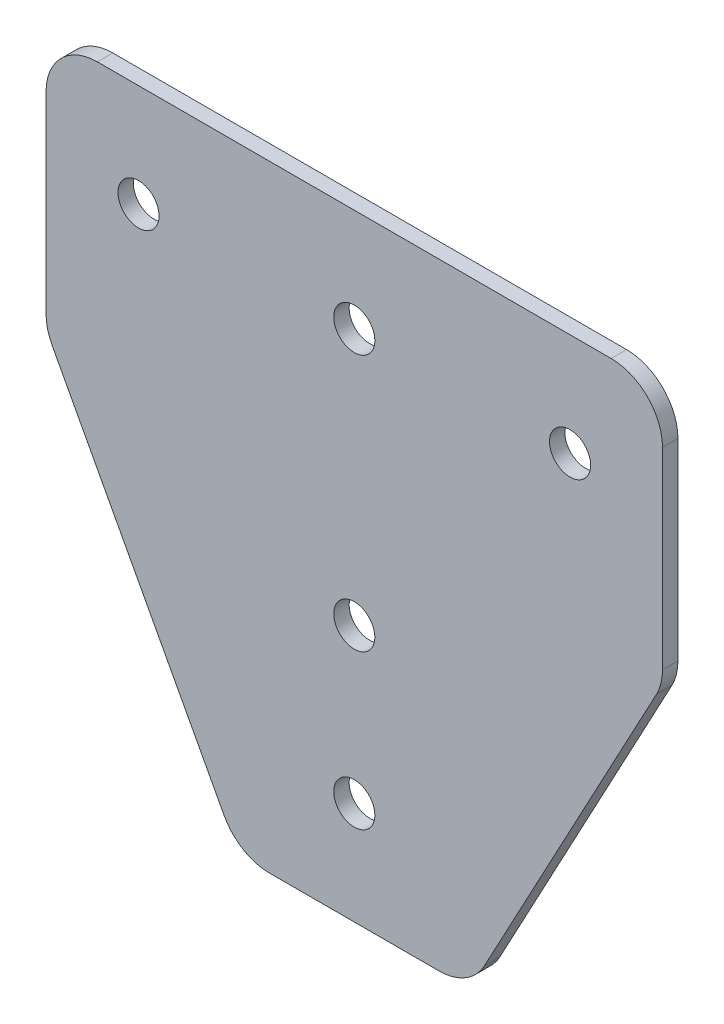
ISO-10303-21;
HEADER;
FILE_DESCRIPTION(('STEP AP214'),'2;1');
FILE_NAME('part.step','',(''),(''),'','','');
FILE_SCHEMA(('AUTOMOTIVE_DESIGN { 1 0 10303 214 1 1 1 1 }'));
ENDSEC;
DATA;
#1=APPLICATION_CONTEXT('core data for automotive mechanical design processes');
#2=APPLICATION_PROTOCOL_DEFINITION('international standard','automotive_design',2000,#1);
#3=PRODUCT_CONTEXT('',#1,'mechanical');
#4=PRODUCT('Part','Part','',(#3));
#5=PRODUCT_RELATED_PRODUCT_CATEGORY('part','',(#4));
#6=PRODUCT_DEFINITION_FORMATION('','',#4);
#7=PRODUCT_DEFINITION_CONTEXT('part definition',#1,'design');
#8=PRODUCT_DEFINITION('design','',#6,#7);
#9=PRODUCT_DEFINITION_SHAPE('','',#8);
#10=(LENGTH_UNIT() NAMED_UNIT(*) SI_UNIT(.MILLI.,.METRE.));
#11=(NAMED_UNIT(*) PLANE_ANGLE_UNIT() SI_UNIT($,.RADIAN.));
#12=(NAMED_UNIT(*) SI_UNIT($,.STERADIAN.) SOLID_ANGLE_UNIT());
#13=UNCERTAINTY_MEASURE_WITH_UNIT(LENGTH_MEASURE(1.E-05),#10,'distance_accuracy_value','');
#14=(GEOMETRIC_REPRESENTATION_CONTEXT(3) GLOBAL_UNCERTAINTY_ASSIGNED_CONTEXT((#13)) GLOBAL_UNIT_ASSIGNED_CONTEXT((#10,
#11,#12)) REPRESENTATION_CONTEXT('',''));
#15=CARTESIAN_POINT('',(0.,0.,0.));
#16=DIRECTION('',(0.,0.,1.));
#17=DIRECTION('',(1.,0.,0.));
#18=AXIS2_PLACEMENT_3D('',#15,#16,#17);
#19=CARTESIAN_POINT('',(0.,0.,3.));
#20=DIRECTION('',(0.,0.,-1.));
#21=DIRECTION('',(-1.,0.,0.));
#22=AXIS2_PLACEMENT_3D('',#19,#20,#21);
#23=PLANE('',#22);
#24=CARTESIAN_POINT('',(0.,40.,3.));
#25=DIRECTION('',(0.,0.,1.));
#26=DIRECTION('',(1.,0.,0.));
#27=AXIS2_PLACEMENT_3D('',#24,#25,#26);
#28=CIRCLE('',#27,4.);
#29=CARTESIAN_POINT('',(4.,40.,3.));
#30=VERTEX_POINT('',#29);
#31=EDGE_CURVE('E340',#30,#30,#28,.T.);
#32=ORIENTED_EDGE('',*,*,#31,.F.);
#33=EDGE_LOOP('',(#32));
#34=FACE_BOUND('',#33,.T.);
#35=CARTESIAN_POINT('',(0.,-40.,3.));
#36=DIRECTION('',(0.,0.,1.));
#37=DIRECTION('',(1.,0.,0.));
#38=AXIS2_PLACEMENT_3D('',#35,#36,#37);
#39=CIRCLE('',#38,4.);
#40=CARTESIAN_POINT('',(4.,-40.,3.));
#41=VERTEX_POINT('',#40);
#42=EDGE_CURVE('E329',#41,#41,#39,.T.);
#43=ORIENTED_EDGE('',*,*,#42,.F.);
#44=EDGE_LOOP('',(#43));
#45=FACE_BOUND('',#44,.T.);
#46=DIRECTION('',(0.,1.,0.));
#47=VECTOR('',#46,1.);
#48=CARTESIAN_POINT('',(60.,60.,3.));
#49=LINE('',#48,#47);
#50=CARTESIAN_POINT('',(60.,12.5098402323581,3.));
#51=VERTEX_POINT('',#50);
#52=CARTESIAN_POINT('',(60.,50.,3.));
#53=VERTEX_POINT('',#52);
#54=EDGE_CURVE('E162',#51,#53,#49,.T.);
#55=ORIENTED_EDGE('',*,*,#54,.T.);
#56=CARTESIAN_POINT('',(50.,50.,3.));
#57=DIRECTION('',(0.,0.,-1.));
#58=DIRECTION('',(-1.,0.,0.));
#59=AXIS2_PLACEMENT_3D('',#56,#57,#58);
#60=CIRCLE('',#59,10.);
#61=CARTESIAN_POINT('',(50.,60.,3.));
#62=VERTEX_POINT('',#61);
#63=EDGE_CURVE('E195',#53,#62,#60,.F.);
#64=ORIENTED_EDGE('',*,*,#63,.T.);
#65=DIRECTION('',(-1.,0.,0.));
#66=VECTOR('',#65,1.);
#67=CARTESIAN_POINT('',(-60.,60.,3.));
#68=LINE('',#67,#66);
#69=CARTESIAN_POINT('',(-50.,60.,3.));
#70=VERTEX_POINT('',#69);
#71=EDGE_CURVE('E145',#62,#70,#68,.T.);
#72=ORIENTED_EDGE('',*,*,#71,.T.);
#73=CARTESIAN_POINT('',(-50.,50.,3.));
#74=DIRECTION('',(0.,0.,-1.));
#75=DIRECTION('',(-1.,0.,0.));
#76=AXIS2_PLACEMENT_3D('',#73,#74,#75);
#77=CIRCLE('',#76,10.);
#78=CARTESIAN_POINT('',(-60.,50.,3.));
#79=VERTEX_POINT('',#78);
#80=EDGE_CURVE('E186',#70,#79,#77,.F.);
#81=ORIENTED_EDGE('',*,*,#80,.T.);
#82=DIRECTION('',(0.,-1.,0.));
#83=VECTOR('',#82,1.);
#84=CARTESIAN_POINT('',(-60.,60.,3.));
#85=LINE('',#84,#83);
#86=CARTESIAN_POINT('',(-60.,12.5098402323581,3.));
#87=VERTEX_POINT('',#86);
#88=EDGE_CURVE('E217',#79,#87,#85,.T.);
#89=ORIENTED_EDGE('',*,*,#88,.T.);
#90=CARTESIAN_POINT('',(-50.,12.5098402323581,3.));
#91=DIRECTION('',(0.,0.,-1.));
#92=DIRECTION('',(-1.,0.,0.));
#93=AXIS2_PLACEMENT_3D('',#90,#91,#92);
#94=CIRCLE('',#93,10.);
#95=CARTESIAN_POINT('',(-58.8147997002878,7.78762610720392,3.));
#96=VERTEX_POINT('',#95);
#97=EDGE_CURVE('E188',#87,#96,#94,.F.);
#98=ORIENTED_EDGE('',*,*,#97,.T.);
#99=DIRECTION('',(0.472221412515419,-0.881479970028782,0.));
#100=VECTOR('',#99,1.);
#101=CARTESIAN_POINT('',(-60.,9.99999999999999,3.));
#102=LINE('',#101,#100);
#103=CARTESIAN_POINT('',(-25.327385290096,-54.7222141251542,3.));
#104=VERTEX_POINT('',#103);
#105=EDGE_CURVE('E230',#96,#104,#102,.T.);
#106=ORIENTED_EDGE('',*,*,#105,.T.);
#107=CARTESIAN_POINT('',(-16.5125855898082,-50.,3.));
#108=DIRECTION('',(0.,0.,-1.));
#109=DIRECTION('',(-1.,0.,0.));
#110=AXIS2_PLACEMENT_3D('',#107,#108,#109);
#111=CIRCLE('',#110,10.);
#112=CARTESIAN_POINT('',(-16.5125855898082,-60.,3.));
#113=VERTEX_POINT('',#112);
#114=EDGE_CURVE('E190',#104,#113,#111,.F.);
#115=ORIENTED_EDGE('',*,*,#114,.T.);
#116=DIRECTION('',(1.,0.,0.));
#117=VECTOR('',#116,1.);
#118=CARTESIAN_POINT('',(-22.5,-60.,3.));
#119=LINE('',#118,#117);
#120=CARTESIAN_POINT('',(16.5125855898081,-60.,3.));
#121=VERTEX_POINT('',#120);
#122=EDGE_CURVE('E232',#113,#121,#119,.T.);
#123=ORIENTED_EDGE('',*,*,#122,.T.);
#124=CARTESIAN_POINT('',(16.5125855898082,-50.,3.));
#125=DIRECTION('',(0.,0.,-1.));
#126=DIRECTION('',(-1.,0.,0.));
#127=AXIS2_PLACEMENT_3D('',#124,#125,#126);
#128=CIRCLE('',#127,10.);
#129=CARTESIAN_POINT('',(25.327385290096,-54.7222141251542,3.));
#130=VERTEX_POINT('',#129);
#131=EDGE_CURVE('E57',#121,#130,#128,.F.);
#132=ORIENTED_EDGE('',*,*,#131,.T.);
#133=DIRECTION('',(0.472221412515419,0.881479970028782,0.));
#134=VECTOR('',#133,1.);
#135=CARTESIAN_POINT('',(60.,9.99999999999999,3.));
#136=LINE('',#135,#134);
#137=CARTESIAN_POINT('',(58.8147997002878,7.78762610720392,3.));
#138=VERTEX_POINT('',#137);
#139=EDGE_CURVE('E234',#130,#138,#136,.T.);
#140=ORIENTED_EDGE('',*,*,#139,.T.);
#141=CARTESIAN_POINT('',(50.,12.5098402323581,3.));
#142=DIRECTION('',(0.,0.,-1.));
#143=DIRECTION('',(-1.,0.,0.));
#144=AXIS2_PLACEMENT_3D('',#141,#142,#143);
#145=CIRCLE('',#144,10.);
#146=EDGE_CURVE('E193',#138,#51,#145,.F.);
#147=ORIENTED_EDGE('',*,*,#146,.T.);
#148=EDGE_LOOP('',(#55,#64,#72,#81,#89,#98,#106,#115,#123,#132,#140,#147));
#149=FACE_BOUND('',#148,.T.);
#150=CARTESIAN_POINT('',(-42.,40.,3.));
#151=DIRECTION('',(0.,0.,1.));
#152=DIRECTION('',(1.,0.,0.));
#153=AXIS2_PLACEMENT_3D('',#150,#151,#152);
#154=CIRCLE('',#153,4.00000000000001);
#155=CARTESIAN_POINT('',(-38.,40.,3.));
#156=VERTEX_POINT('',#155);
#157=EDGE_CURVE('E153',#156,#156,#154,.T.);
#158=ORIENTED_EDGE('',*,*,#157,.F.);
#159=EDGE_LOOP('',(#158));
#160=FACE_BOUND('',#159,.T.);
#161=CARTESIAN_POINT('',(0.,-9.99999999999999,3.));
#162=DIRECTION('',(0.,0.,1.));
#163=DIRECTION('',(1.,0.,0.));
#164=AXIS2_PLACEMENT_3D('',#161,#162,#163);
#165=CIRCLE('',#164,4.);
#166=CARTESIAN_POINT('',(4.,-9.99999999999999,3.));
#167=VERTEX_POINT('',#166);
#168=EDGE_CURVE('E334',#167,#167,#165,.T.);
#169=ORIENTED_EDGE('',*,*,#168,.F.);
#170=EDGE_LOOP('',(#169));
#171=FACE_BOUND('',#170,.T.);
#172=CARTESIAN_POINT('',(42.,40.,3.));
#173=DIRECTION('',(0.,0.,1.));
#174=DIRECTION('',(-1.,0.,0.));
#175=AXIS2_PLACEMENT_3D('',#172,#173,#174);
#176=CIRCLE('',#175,4.00000000000001);
#177=CARTESIAN_POINT('',(38.,40.,3.));
#178=VERTEX_POINT('',#177);
#179=EDGE_CURVE('E346',#178,#178,#176,.T.);
#180=ORIENTED_EDGE('',*,*,#179,.F.);
#181=EDGE_LOOP('',(#180));
#182=FACE_BOUND('',#181,.T.);
#183=ADVANCED_FACE('F35',(#34,#45,#149,#160,#171,#182),#23,.F.);
#184=CARTESIAN_POINT('',(0.,0.,0.));
#185=DIRECTION('',(0.,0.,-1.));
#186=DIRECTION('',(-1.,0.,0.));
#187=AXIS2_PLACEMENT_3D('',#184,#185,#186);
#188=PLANE('',#187);
#189=CARTESIAN_POINT('',(0.,40.,0.));
#190=DIRECTION('',(0.,0.,1.));
#191=DIRECTION('',(1.,0.,0.));
#192=AXIS2_PLACEMENT_3D('',#189,#190,#191);
#193=CIRCLE('',#192,4.);
#194=CARTESIAN_POINT('',(4.,40.,0.));
#195=VERTEX_POINT('',#194);
#196=EDGE_CURVE('E343',#195,#195,#193,.T.);
#197=ORIENTED_EDGE('',*,*,#196,.T.);
#198=EDGE_LOOP('',(#197));
#199=FACE_BOUND('',#198,.T.);
#200=CARTESIAN_POINT('',(0.,-40.,0.));
#201=DIRECTION('',(0.,0.,1.));
#202=DIRECTION('',(1.,0.,0.));
#203=AXIS2_PLACEMENT_3D('',#200,#201,#202);
#204=CIRCLE('',#203,4.);
#205=CARTESIAN_POINT('',(4.,-40.,0.));
#206=VERTEX_POINT('',#205);
#207=EDGE_CURVE('E331',#206,#206,#204,.T.);
#208=ORIENTED_EDGE('',*,*,#207,.T.);
#209=EDGE_LOOP('',(#208));
#210=FACE_BOUND('',#209,.T.);
#211=DIRECTION('',(-1.,0.,0.));
#212=VECTOR('',#211,1.);
#213=CARTESIAN_POINT('',(-60.,60.,0.));
#214=LINE('',#213,#212);
#215=CARTESIAN_POINT('',(50.,60.,0.));
#216=VERTEX_POINT('',#215);
#217=CARTESIAN_POINT('',(-50.,60.,0.));
#218=VERTEX_POINT('',#217);
#219=EDGE_CURVE('E142',#216,#218,#214,.T.);
#220=ORIENTED_EDGE('',*,*,#219,.F.);
#221=CARTESIAN_POINT('',(50.,50.,0.));
#222=DIRECTION('',(0.,0.,-1.));
#223=DIRECTION('',(-1.,0.,0.));
#224=AXIS2_PLACEMENT_3D('',#221,#222,#223);
#225=CIRCLE('',#224,10.);
#226=CARTESIAN_POINT('',(60.,50.,0.));
#227=VERTEX_POINT('',#226);
#228=EDGE_CURVE('E125',#216,#227,#225,.T.);
#229=ORIENTED_EDGE('',*,*,#228,.T.);
#230=DIRECTION('',(0.,1.,0.));
#231=VECTOR('',#230,1.);
#232=CARTESIAN_POINT('',(60.,60.,0.));
#233=LINE('',#232,#231);
#234=CARTESIAN_POINT('',(60.,12.5098402323581,0.));
#235=VERTEX_POINT('',#234);
#236=EDGE_CURVE('E172',#235,#227,#233,.T.);
#237=ORIENTED_EDGE('',*,*,#236,.F.);
#238=CARTESIAN_POINT('',(50.,12.5098402323581,0.));
#239=DIRECTION('',(0.,0.,-1.));
#240=DIRECTION('',(-1.,0.,0.));
#241=AXIS2_PLACEMENT_3D('',#238,#239,#240);
#242=CIRCLE('',#241,10.);
#243=CARTESIAN_POINT('',(58.8147997002878,7.78762610720392,0.));
#244=VERTEX_POINT('',#243);
#245=EDGE_CURVE('E136',#235,#244,#242,.T.);
#246=ORIENTED_EDGE('',*,*,#245,.T.);
#247=DIRECTION('',(0.472221412515419,0.881479970028782,0.));
#248=VECTOR('',#247,1.);
#249=CARTESIAN_POINT('',(60.,9.99999999999999,0.));
#250=LINE('',#249,#248);
#251=CARTESIAN_POINT('',(25.327385290096,-54.7222141251542,0.));
#252=VERTEX_POINT('',#251);
#253=EDGE_CURVE('E170',#252,#244,#250,.T.);
#254=ORIENTED_EDGE('',*,*,#253,.F.);
#255=CARTESIAN_POINT('',(16.5125855898082,-50.,0.));
#256=DIRECTION('',(0.,0.,-1.));
#257=DIRECTION('',(-1.,0.,0.));
#258=AXIS2_PLACEMENT_3D('',#255,#256,#257);
#259=CIRCLE('',#258,10.);
#260=CARTESIAN_POINT('',(16.5125855898081,-60.,0.));
#261=VERTEX_POINT('',#260);
#262=EDGE_CURVE('E180',#252,#261,#259,.T.);
#263=ORIENTED_EDGE('',*,*,#262,.T.);
#264=DIRECTION('',(1.,0.,0.));
#265=VECTOR('',#264,1.);
#266=CARTESIAN_POINT('',(-22.5,-60.,0.));
#267=LINE('',#266,#265);
#268=CARTESIAN_POINT('',(-16.5125855898082,-60.,0.));
#269=VERTEX_POINT('',#268);
#270=EDGE_CURVE('E167',#269,#261,#267,.T.);
#271=ORIENTED_EDGE('',*,*,#270,.F.);
#272=CARTESIAN_POINT('',(-16.5125855898082,-50.,0.));
#273=DIRECTION('',(0.,0.,-1.));
#274=DIRECTION('',(-1.,0.,0.));
#275=AXIS2_PLACEMENT_3D('',#272,#273,#274);
#276=CIRCLE('',#275,10.);
#277=CARTESIAN_POINT('',(-25.327385290096,-54.7222141251542,0.));
#278=VERTEX_POINT('',#277);
#279=EDGE_CURVE('E178',#269,#278,#276,.T.);
#280=ORIENTED_EDGE('',*,*,#279,.T.);
#281=DIRECTION('',(0.472221412515419,-0.881479970028782,0.));
#282=VECTOR('',#281,1.);
#283=CARTESIAN_POINT('',(-60.,9.99999999999999,0.));
#284=LINE('',#283,#282);
#285=CARTESIAN_POINT('',(-58.8147997002878,7.78762610720392,0.));
#286=VERTEX_POINT('',#285);
#287=EDGE_CURVE('E156',#286,#278,#284,.T.);
#288=ORIENTED_EDGE('',*,*,#287,.F.);
#289=CARTESIAN_POINT('',(-50.,12.5098402323581,0.));
#290=DIRECTION('',(0.,0.,-1.));
#291=DIRECTION('',(-1.,0.,0.));
#292=AXIS2_PLACEMENT_3D('',#289,#290,#291);
#293=CIRCLE('',#292,10.);
#294=CARTESIAN_POINT('',(-60.,12.5098402323581,0.));
#295=VERTEX_POINT('',#294);
#296=EDGE_CURVE('E176',#286,#295,#293,.T.);
#297=ORIENTED_EDGE('',*,*,#296,.T.);
#298=DIRECTION('',(0.,-1.,0.));
#299=VECTOR('',#298,1.);
#300=CARTESIAN_POINT('',(-60.,60.,0.));
#301=LINE('',#300,#299);
#302=CARTESIAN_POINT('',(-60.,50.,0.));
#303=VERTEX_POINT('',#302);
#304=EDGE_CURVE('E152',#303,#295,#301,.T.);
#305=ORIENTED_EDGE('',*,*,#304,.F.);
#306=CARTESIAN_POINT('',(-50.,50.,0.));
#307=DIRECTION('',(0.,0.,-1.));
#308=DIRECTION('',(-1.,0.,0.));
#309=AXIS2_PLACEMENT_3D('',#306,#307,#308);
#310=CIRCLE('',#309,10.);
#311=EDGE_CURVE('E146',#303,#218,#310,.T.);
#312=ORIENTED_EDGE('',*,*,#311,.T.);
#313=EDGE_LOOP('',(#220,#229,#237,#246,#254,#263,#271,#280,#288,#297,#305,#312));
#314=FACE_BOUND('',#313,.T.);
#315=CARTESIAN_POINT('',(-42.,40.,0.));
#316=DIRECTION('',(0.,0.,1.));
#317=DIRECTION('',(1.,0.,0.));
#318=AXIS2_PLACEMENT_3D('',#315,#316,#317);
#319=CIRCLE('',#318,4.00000000000001);
#320=CARTESIAN_POINT('',(-38.,40.,0.));
#321=VERTEX_POINT('',#320);
#322=EDGE_CURVE('E159',#321,#321,#319,.T.);
#323=ORIENTED_EDGE('',*,*,#322,.T.);
#324=EDGE_LOOP('',(#323));
#325=FACE_BOUND('',#324,.T.);
#326=CARTESIAN_POINT('',(0.,-9.99999999999999,0.));
#327=DIRECTION('',(0.,0.,1.));
#328=DIRECTION('',(1.,0.,0.));
#329=AXIS2_PLACEMENT_3D('',#326,#327,#328);
#330=CIRCLE('',#329,4.);
#331=CARTESIAN_POINT('',(4.,-9.99999999999999,0.));
#332=VERTEX_POINT('',#331);
#333=EDGE_CURVE('E337',#332,#332,#330,.T.);
#334=ORIENTED_EDGE('',*,*,#333,.T.);
#335=EDGE_LOOP('',(#334));
#336=FACE_BOUND('',#335,.T.);
#337=CARTESIAN_POINT('',(42.,40.,0.));
#338=DIRECTION('',(0.,0.,1.));
#339=DIRECTION('',(-1.,0.,0.));
#340=AXIS2_PLACEMENT_3D('',#337,#338,#339);
#341=CIRCLE('',#340,4.00000000000001);
#342=CARTESIAN_POINT('',(38.,40.,0.));
#343=VERTEX_POINT('',#342);
#344=EDGE_CURVE('E349',#343,#343,#341,.T.);
#345=ORIENTED_EDGE('',*,*,#344,.T.);
#346=EDGE_LOOP('',(#345));
#347=FACE_BOUND('',#346,.T.);
#348=ADVANCED_FACE('F149',(#199,#210,#314,#325,#336,#347),#188,.T.);
#349=CARTESIAN_POINT('',(-60.,60.,3.));
#350=DIRECTION('',(0.,-1.,0.));
#351=DIRECTION('',(0.,0.,-1.));
#352=AXIS2_PLACEMENT_3D('',#349,#350,#351);
#353=PLANE('',#352);
#354=ORIENTED_EDGE('',*,*,#71,.F.);
#355=DIRECTION('',(0.,0.,-1.));
#356=VECTOR('',#355,1.);
#357=CARTESIAN_POINT('',(50.,60.,3.));
#358=LINE('',#357,#356);
#359=EDGE_CURVE('E129',#62,#216,#358,.T.);
#360=ORIENTED_EDGE('',*,*,#359,.T.);
#361=ORIENTED_EDGE('',*,*,#219,.T.);
#362=DIRECTION('',(0.,0.,-1.));
#363=VECTOR('',#362,1.);
#364=CARTESIAN_POINT('',(-50.,60.,3.));
#365=LINE('',#364,#363);
#366=EDGE_CURVE('E147',#218,#70,#365,.F.);
#367=ORIENTED_EDGE('',*,*,#366,.T.);
#368=EDGE_LOOP('',(#354,#360,#361,#367));
#369=FACE_BOUND('',#368,.T.);
#370=ADVANCED_FACE('F141',(#369),#353,.F.);
#371=CARTESIAN_POINT('',(-60.,60.,3.));
#372=DIRECTION('',(1.,0.,0.));
#373=DIRECTION('',(0.,1.,0.));
#374=AXIS2_PLACEMENT_3D('',#371,#372,#373);
#375=PLANE('',#374);
#376=ORIENTED_EDGE('',*,*,#304,.T.);
#377=DIRECTION('',(0.,0.,-1.));
#378=VECTOR('',#377,1.);
#379=CARTESIAN_POINT('',(-60.,12.5098402323581,3.));
#380=LINE('',#379,#378);
#381=EDGE_CURVE('E11',#295,#87,#380,.F.);
#382=ORIENTED_EDGE('',*,*,#381,.T.);
#383=ORIENTED_EDGE('',*,*,#88,.F.);
#384=DIRECTION('',(0.,0.,-1.));
#385=VECTOR('',#384,1.);
#386=CARTESIAN_POINT('',(-60.,50.,3.));
#387=LINE('',#386,#385);
#388=EDGE_CURVE('E43',#79,#303,#387,.T.);
#389=ORIENTED_EDGE('',*,*,#388,.T.);
#390=EDGE_LOOP('',(#376,#382,#383,#389));
#391=FACE_BOUND('',#390,.T.);
#392=ADVANCED_FACE('F214',(#391),#375,.F.);
#393=CARTESIAN_POINT('',(-60.,9.99999999999999,3.));
#394=DIRECTION('',(0.881479970028782,0.472221412515419,0.));
#395=DIRECTION('',(-0.472221412515419,0.881479970028782,0.));
#396=AXIS2_PLACEMENT_3D('',#393,#394,#395);
#397=PLANE('',#396);
#398=ORIENTED_EDGE('',*,*,#287,.T.);
#399=DIRECTION('',(0.,0.,-1.));
#400=VECTOR('',#399,1.);
#401=CARTESIAN_POINT('',(-25.327385290096,-54.7222141251542,3.));
#402=LINE('',#401,#400);
#403=EDGE_CURVE('E209',#278,#104,#402,.F.);
#404=ORIENTED_EDGE('',*,*,#403,.T.);
#405=ORIENTED_EDGE('',*,*,#105,.F.);
#406=DIRECTION('',(0.,0.,-1.));
#407=VECTOR('',#406,1.);
#408=CARTESIAN_POINT('',(-58.8147997002878,7.78762610720392,3.));
#409=LINE('',#408,#407);
#410=EDGE_CURVE('E206',#96,#286,#409,.T.);
#411=ORIENTED_EDGE('',*,*,#410,.T.);
#412=EDGE_LOOP('',(#398,#404,#405,#411));
#413=FACE_BOUND('',#412,.T.);
#414=ADVANCED_FACE('F227',(#413),#397,.F.);
#415=CARTESIAN_POINT('',(-22.5,-60.,3.));
#416=DIRECTION('',(0.,1.,0.));
#417=DIRECTION('',(0.,0.,1.));
#418=AXIS2_PLACEMENT_3D('',#415,#416,#417);
#419=PLANE('',#418);
#420=ORIENTED_EDGE('',*,*,#270,.T.);
#421=DIRECTION('',(0.,0.,-1.));
#422=VECTOR('',#421,1.);
#423=CARTESIAN_POINT('',(16.5125855898082,-60.,3.));
#424=LINE('',#423,#422);
#425=EDGE_CURVE('E204',#261,#121,#424,.F.);
#426=ORIENTED_EDGE('',*,*,#425,.T.);
#427=ORIENTED_EDGE('',*,*,#122,.F.);
#428=DIRECTION('',(0.,0.,-1.));
#429=VECTOR('',#428,1.);
#430=CARTESIAN_POINT('',(-16.5125855898082,-60.,3.));
#431=LINE('',#430,#429);
#432=EDGE_CURVE('E201',#113,#269,#431,.T.);
#433=ORIENTED_EDGE('',*,*,#432,.T.);
#434=EDGE_LOOP('',(#420,#426,#427,#433));
#435=FACE_BOUND('',#434,.T.);
#436=ADVANCED_FACE('F255',(#435),#419,.F.);
#437=CARTESIAN_POINT('',(60.,9.99999999999999,3.));
#438=DIRECTION('',(-0.881479970028782,0.472221412515419,0.));
#439=DIRECTION('',(-0.472221412515419,-0.881479970028782,0.));
#440=AXIS2_PLACEMENT_3D('',#437,#438,#439);
#441=PLANE('',#440);
#442=ORIENTED_EDGE('',*,*,#253,.T.);
#443=DIRECTION('',(0.,0.,-1.));
#444=VECTOR('',#443,1.);
#445=CARTESIAN_POINT('',(58.8147997002878,7.78762610720392,3.));
#446=LINE('',#445,#444);
#447=EDGE_CURVE('E50',#244,#138,#446,.F.);
#448=ORIENTED_EDGE('',*,*,#447,.T.);
#449=ORIENTED_EDGE('',*,*,#139,.F.);
#450=DIRECTION('',(0.,0.,-1.));
#451=VECTOR('',#450,1.);
#452=CARTESIAN_POINT('',(25.327385290096,-54.7222141251542,3.));
#453=LINE('',#452,#451);
#454=EDGE_CURVE('E197',#130,#252,#453,.T.);
#455=ORIENTED_EDGE('',*,*,#454,.T.);
#456=EDGE_LOOP('',(#442,#448,#449,#455));
#457=FACE_BOUND('',#456,.T.);
#458=ADVANCED_FACE('F248',(#457),#441,.F.);
#459=CARTESIAN_POINT('',(60.,60.,3.));
#460=DIRECTION('',(-1.,0.,0.));
#461=DIRECTION('',(0.,-1.,0.));
#462=AXIS2_PLACEMENT_3D('',#459,#460,#461);
#463=PLANE('',#462);
#464=ORIENTED_EDGE('',*,*,#236,.T.);
#465=DIRECTION('',(0.,0.,-1.));
#466=VECTOR('',#465,1.);
#467=CARTESIAN_POINT('',(60.,50.,3.));
#468=LINE('',#467,#466);
#469=EDGE_CURVE('E130',#227,#53,#468,.F.);
#470=ORIENTED_EDGE('',*,*,#469,.T.);
#471=ORIENTED_EDGE('',*,*,#54,.F.);
#472=DIRECTION('',(0.,0.,-1.));
#473=VECTOR('',#472,1.);
#474=CARTESIAN_POINT('',(60.,12.5098402323581,3.));
#475=LINE('',#474,#473);
#476=EDGE_CURVE('E135',#51,#235,#475,.T.);
#477=ORIENTED_EDGE('',*,*,#476,.T.);
#478=EDGE_LOOP('',(#464,#470,#471,#477));
#479=FACE_BOUND('',#478,.T.);
#480=ADVANCED_FACE('F244',(#479),#463,.F.);
#481=CARTESIAN_POINT('',(-42.,40.,3.));
#482=DIRECTION('',(0.,0.,-1.));
#483=DIRECTION('',(-1.,0.,0.));
#484=AXIS2_PLACEMENT_3D('',#481,#482,#483);
#485=CYLINDRICAL_SURFACE('',#484,4.00000000000001);
#486=ORIENTED_EDGE('',*,*,#157,.T.);
#487=EDGE_LOOP('',(#486));
#488=FACE_BOUND('',#487,.T.);
#489=ORIENTED_EDGE('',*,*,#322,.F.);
#490=EDGE_LOOP('',(#489));
#491=FACE_BOUND('',#490,.T.);
#492=ADVANCED_FACE('F278',(#488,#491),#485,.F.);
#493=CARTESIAN_POINT('',(0.,-40.,3.));
#494=DIRECTION('',(0.,0.,-1.));
#495=DIRECTION('',(-1.,0.,0.));
#496=AXIS2_PLACEMENT_3D('',#493,#494,#495);
#497=CYLINDRICAL_SURFACE('',#496,4.);
#498=ORIENTED_EDGE('',*,*,#42,.T.);
#499=EDGE_LOOP('',(#498));
#500=FACE_BOUND('',#499,.T.);
#501=ORIENTED_EDGE('',*,*,#207,.F.);
#502=EDGE_LOOP('',(#501));
#503=FACE_BOUND('',#502,.T.);
#504=ADVANCED_FACE('F369',(#500,#503),#497,.F.);
#505=CARTESIAN_POINT('',(0.,-9.99999999999999,3.));
#506=DIRECTION('',(0.,0.,-1.));
#507=DIRECTION('',(-1.,0.,0.));
#508=AXIS2_PLACEMENT_3D('',#505,#506,#507);
#509=CYLINDRICAL_SURFACE('',#508,4.);
#510=ORIENTED_EDGE('',*,*,#168,.T.);
#511=EDGE_LOOP('',(#510));
#512=FACE_BOUND('',#511,.T.);
#513=ORIENTED_EDGE('',*,*,#333,.F.);
#514=EDGE_LOOP('',(#513));
#515=FACE_BOUND('',#514,.T.);
#516=ADVANCED_FACE('F364',(#512,#515),#509,.F.);
#517=CARTESIAN_POINT('',(0.,40.,3.));
#518=DIRECTION('',(0.,0.,-1.));
#519=DIRECTION('',(-1.,0.,0.));
#520=AXIS2_PLACEMENT_3D('',#517,#518,#519);
#521=CYLINDRICAL_SURFACE('',#520,4.);
#522=ORIENTED_EDGE('',*,*,#31,.T.);
#523=EDGE_LOOP('',(#522));
#524=FACE_BOUND('',#523,.T.);
#525=ORIENTED_EDGE('',*,*,#196,.F.);
#526=EDGE_LOOP('',(#525));
#527=FACE_BOUND('',#526,.T.);
#528=ADVANCED_FACE('F357',(#524,#527),#521,.F.);
#529=CARTESIAN_POINT('',(42.,40.,3.));
#530=DIRECTION('',(0.,0.,-1.));
#531=DIRECTION('',(-1.,0.,0.));
#532=AXIS2_PLACEMENT_3D('',#529,#530,#531);
#533=CYLINDRICAL_SURFACE('',#532,4.00000000000001);
#534=ORIENTED_EDGE('',*,*,#179,.T.);
#535=EDGE_LOOP('',(#534));
#536=FACE_BOUND('',#535,.T.);
#537=ORIENTED_EDGE('',*,*,#344,.F.);
#538=EDGE_LOOP('',(#537));
#539=FACE_BOUND('',#538,.T.);
#540=ADVANCED_FACE('F295',(#536,#539),#533,.F.);
#541=CARTESIAN_POINT('',(50.,50.,3.));
#542=DIRECTION('',(0.,0.,-1.));
#543=DIRECTION('',(-1.,0.,0.));
#544=AXIS2_PLACEMENT_3D('',#541,#542,#543);
#545=CYLINDRICAL_SURFACE('',#544,10.);
#546=ORIENTED_EDGE('',*,*,#63,.F.);
#547=ORIENTED_EDGE('',*,*,#469,.F.);
#548=ORIENTED_EDGE('',*,*,#228,.F.);
#549=ORIENTED_EDGE('',*,*,#359,.F.);
#550=EDGE_LOOP('',(#546,#547,#548,#549));
#551=FACE_BOUND('',#550,.T.);
#552=ADVANCED_FACE('F128',(#551),#545,.T.);
#553=CARTESIAN_POINT('',(50.,12.5098402323581,3.));
#554=DIRECTION('',(0.,0.,-1.));
#555=DIRECTION('',(-1.,0.,0.));
#556=AXIS2_PLACEMENT_3D('',#553,#554,#555);
#557=CYLINDRICAL_SURFACE('',#556,10.);
#558=ORIENTED_EDGE('',*,*,#146,.F.);
#559=ORIENTED_EDGE('',*,*,#447,.F.);
#560=ORIENTED_EDGE('',*,*,#245,.F.);
#561=ORIENTED_EDGE('',*,*,#476,.F.);
#562=EDGE_LOOP('',(#558,#559,#560,#561));
#563=FACE_BOUND('',#562,.T.);
#564=ADVANCED_FACE('F246',(#563),#557,.T.);
#565=CARTESIAN_POINT('',(16.5125855898082,-50.,3.));
#566=DIRECTION('',(0.,0.,-1.));
#567=DIRECTION('',(-1.,0.,0.));
#568=AXIS2_PLACEMENT_3D('',#565,#566,#567);
#569=CYLINDRICAL_SURFACE('',#568,10.);
#570=ORIENTED_EDGE('',*,*,#131,.F.);
#571=ORIENTED_EDGE('',*,*,#425,.F.);
#572=ORIENTED_EDGE('',*,*,#262,.F.);
#573=ORIENTED_EDGE('',*,*,#454,.F.);
#574=EDGE_LOOP('',(#570,#571,#572,#573));
#575=FACE_BOUND('',#574,.T.);
#576=ADVANCED_FACE('F251',(#575),#569,.T.);
#577=CARTESIAN_POINT('',(-16.5125855898082,-50.,3.));
#578=DIRECTION('',(0.,0.,-1.));
#579=DIRECTION('',(-1.,0.,0.));
#580=AXIS2_PLACEMENT_3D('',#577,#578,#579);
#581=CYLINDRICAL_SURFACE('',#580,10.);
#582=ORIENTED_EDGE('',*,*,#114,.F.);
#583=ORIENTED_EDGE('',*,*,#403,.F.);
#584=ORIENTED_EDGE('',*,*,#279,.F.);
#585=ORIENTED_EDGE('',*,*,#432,.F.);
#586=EDGE_LOOP('',(#582,#583,#584,#585));
#587=FACE_BOUND('',#586,.T.);
#588=ADVANCED_FACE('F259',(#587),#581,.T.);
#589=CARTESIAN_POINT('',(-50.,12.5098402323581,3.));
#590=DIRECTION('',(0.,0.,-1.));
#591=DIRECTION('',(-1.,0.,0.));
#592=AXIS2_PLACEMENT_3D('',#589,#590,#591);
#593=CYLINDRICAL_SURFACE('',#592,10.);
#594=ORIENTED_EDGE('',*,*,#97,.F.);
#595=ORIENTED_EDGE('',*,*,#381,.F.);
#596=ORIENTED_EDGE('',*,*,#296,.F.);
#597=ORIENTED_EDGE('',*,*,#410,.F.);
#598=EDGE_LOOP('',(#594,#595,#596,#597));
#599=FACE_BOUND('',#598,.T.);
#600=ADVANCED_FACE('F224',(#599),#593,.T.);
#601=CARTESIAN_POINT('',(-50.,50.,3.));
#602=DIRECTION('',(0.,0.,-1.));
#603=DIRECTION('',(-1.,0.,0.));
#604=AXIS2_PLACEMENT_3D('',#601,#602,#603);
#605=CYLINDRICAL_SURFACE('',#604,10.);
#606=ORIENTED_EDGE('',*,*,#80,.F.);
#607=ORIENTED_EDGE('',*,*,#366,.F.);
#608=ORIENTED_EDGE('',*,*,#311,.F.);
#609=ORIENTED_EDGE('',*,*,#388,.F.);
#610=EDGE_LOOP('',(#606,#607,#608,#609));
#611=FACE_BOUND('',#610,.T.);
#612=ADVANCED_FACE('F37',(#611),#605,.T.);
#613=CLOSED_SHELL('',(#183,#348,#370,#392,#414,#436,#458,#480,#492,#504,#516,#528,#540,#552,
#564,#576,#588,#600,#612));
#614=MANIFOLD_SOLID_BREP('B2',#613);
#615=ADVANCED_BREP_SHAPE_REPRESENTATION('',(#18,#614),#14);
#616=SHAPE_DEFINITION_REPRESENTATION(#9,#615);
ENDSEC;
END-ISO-10303-21;
